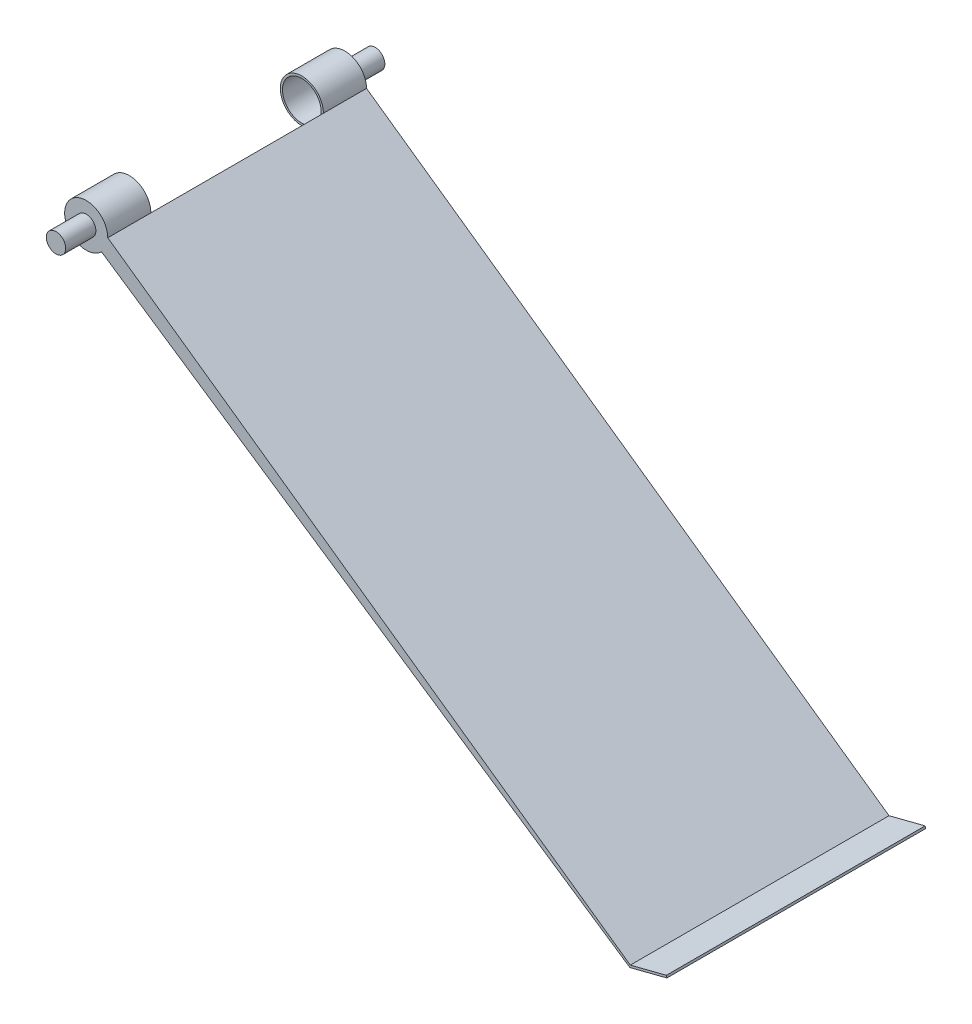
ISO-10303-21;
HEADER;
FILE_DESCRIPTION(('STEP AP214'),'2;1');
FILE_NAME('part.step','',(''),(''),'','','');
FILE_SCHEMA(('AUTOMOTIVE_DESIGN { 1 0 10303 214 1 1 1 1 }'));
ENDSEC;
DATA;
#1=APPLICATION_CONTEXT('core data for automotive mechanical design processes');
#2=APPLICATION_PROTOCOL_DEFINITION('international standard','automotive_design',2000,#1);
#3=PRODUCT_CONTEXT('',#1,'mechanical');
#4=PRODUCT('Part','Part','',(#3));
#5=PRODUCT_RELATED_PRODUCT_CATEGORY('part','',(#4));
#6=PRODUCT_DEFINITION_FORMATION('','',#4);
#7=PRODUCT_DEFINITION_CONTEXT('part definition',#1,'design');
#8=PRODUCT_DEFINITION('design','',#6,#7);
#9=PRODUCT_DEFINITION_SHAPE('','',#8);
#10=(LENGTH_UNIT() NAMED_UNIT(*) SI_UNIT(.MILLI.,.METRE.));
#11=(NAMED_UNIT(*) PLANE_ANGLE_UNIT() SI_UNIT($,.RADIAN.));
#12=(NAMED_UNIT(*) SI_UNIT($,.STERADIAN.) SOLID_ANGLE_UNIT());
#13=UNCERTAINTY_MEASURE_WITH_UNIT(LENGTH_MEASURE(1.E-05),#10,'distance_accuracy_value','');
#14=(GEOMETRIC_REPRESENTATION_CONTEXT(3) GLOBAL_UNCERTAINTY_ASSIGNED_CONTEXT((#13)) GLOBAL_UNIT_ASSIGNED_CONTEXT((#10,
#11,#12)) REPRESENTATION_CONTEXT('',''));
#15=CARTESIAN_POINT('',(0.,0.,0.));
#16=DIRECTION('',(0.,0.,1.));
#17=DIRECTION('',(1.,0.,0.));
#18=AXIS2_PLACEMENT_3D('',#15,#16,#17);
#19=CARTESIAN_POINT('',(0.,0.,-6.));
#20=DIRECTION('',(0.,0.,1.));
#21=DIRECTION('',(1.,0.,0.));
#22=AXIS2_PLACEMENT_3D('',#19,#20,#21);
#23=CYLINDRICAL_SURFACE('',#22,0.5);
#24=DIRECTION('',(0.,0.,1.));
#25=VECTOR('',#24,1.);
#26=CARTESIAN_POINT('',(0.5,0.,-6.));
#27=LINE('',#26,#25);
#28=CARTESIAN_POINT('',(0.5,0.,-5.));
#29=VERTEX_POINT('',#28);
#30=CARTESIAN_POINT('',(0.5,0.,-1.));
#31=VERTEX_POINT('',#30);
#32=EDGE_CURVE('E54',#29,#31,#27,.T.);
#33=ORIENTED_EDGE('',*,*,#32,.F.);
#34=CARTESIAN_POINT('',(0.,0.,-5.));
#35=DIRECTION('',(0.,0.,1.));
#36=DIRECTION('',(1.,0.,0.));
#37=AXIS2_PLACEMENT_3D('',#34,#35,#36);
#38=CIRCLE('',#37,0.5);
#39=CARTESIAN_POINT('',(0.353553390593274,-0.353553390593274,-5.));
#40=VERTEX_POINT('',#39);
#41=EDGE_CURVE('E59',#40,#29,#38,.T.);
#42=ORIENTED_EDGE('',*,*,#41,.F.);
#43=DIRECTION('',(0.,0.,1.));
#44=VECTOR('',#43,1.);
#45=CARTESIAN_POINT('',(0.353553390593274,-0.353553390593274,-6.));
#46=LINE('',#45,#44);
#47=CARTESIAN_POINT('',(0.353553390593274,-0.353553390593274,-1.));
#48=VERTEX_POINT('',#47);
#49=EDGE_CURVE('E120',#40,#48,#46,.T.);
#50=ORIENTED_EDGE('',*,*,#49,.T.);
#51=CARTESIAN_POINT('',(0.,0.,-1.));
#52=DIRECTION('',(0.,0.,1.));
#53=DIRECTION('',(1.,0.,0.));
#54=AXIS2_PLACEMENT_3D('',#51,#52,#53);
#55=CIRCLE('',#54,0.5);
#56=EDGE_CURVE('E162',#31,#48,#55,.F.);
#57=ORIENTED_EDGE('',*,*,#56,.F.);
#58=EDGE_LOOP('',(#33,#42,#50,#57));
#59=FACE_BOUND('',#58,.T.);
#60=ADVANCED_FACE('F37',(#59),#23,.F.);
#61=CARTESIAN_POINT('',(0.,0.,-1.));
#62=DIRECTION('',(0.,0.,1.));
#63=DIRECTION('',(1.,0.,0.));
#64=AXIS2_PLACEMENT_3D('',#61,#62,#63);
#65=CYLINDRICAL_SURFACE('',#64,0.5);
#66=CARTESIAN_POINT('',(0.5,0.,0.));
#67=VERTEX_POINT('',#66);
#68=EDGE_CURVE('E163',#31,#67,#27,.T.);
#69=ORIENTED_EDGE('',*,*,#68,.F.);
#70=CARTESIAN_POINT('',(0.,0.,-1.));
#71=DIRECTION('',(0.,0.,1.));
#72=DIRECTION('',(1.,0.,0.));
#73=AXIS2_PLACEMENT_3D('',#70,#71,#72);
#74=CIRCLE('',#73,0.5);
#75=EDGE_CURVE('E46',#31,#48,#74,.T.);
#76=ORIENTED_EDGE('',*,*,#75,.T.);
#77=CARTESIAN_POINT('',(0.353553390593274,-0.353553390593274,0.));
#78=VERTEX_POINT('',#77);
#79=EDGE_CURVE('E126',#48,#78,#46,.T.);
#80=ORIENTED_EDGE('',*,*,#79,.T.);
#81=CARTESIAN_POINT('',(0.,0.,0.));
#82=DIRECTION('',(0.,0.,1.));
#83=DIRECTION('',(1.,0.,0.));
#84=AXIS2_PLACEMENT_3D('',#81,#82,#83);
#85=CIRCLE('',#84,0.5);
#86=EDGE_CURVE('E41',#67,#78,#85,.T.);
#87=ORIENTED_EDGE('',*,*,#86,.F.);
#88=EDGE_LOOP('',(#69,#76,#80,#87));
#89=FACE_BOUND('',#88,.T.);
#90=ADVANCED_FACE('F39',(#89),#65,.T.);
#91=CARTESIAN_POINT('',(0.,0.,-1.));
#92=DIRECTION('',(0.,0.,1.));
#93=DIRECTION('',(1.,0.,0.));
#94=AXIS2_PLACEMENT_3D('',#91,#92,#93);
#95=PLANE('',#94);
#96=CARTESIAN_POINT('',(0.,0.,-1.));
#97=DIRECTION('',(0.,0.,-1.));
#98=DIRECTION('',(-1.,0.,0.));
#99=AXIS2_PLACEMENT_3D('',#96,#97,#98);
#100=CIRCLE('',#99,0.45);
#101=CARTESIAN_POINT('',(-0.45,0.,-1.));
#102=VERTEX_POINT('',#101);
#103=EDGE_CURVE('E175',#102,#102,#100,.T.);
#104=ORIENTED_EDGE('',*,*,#103,.F.);
#105=EDGE_LOOP('',(#104));
#106=FACE_BOUND('',#105,.T.);
#107=ORIENTED_EDGE('',*,*,#75,.F.);
#108=ORIENTED_EDGE('',*,*,#56,.T.);
#109=EDGE_LOOP('',(#107,#108));
#110=FACE_BOUND('',#109,.T.);
#111=ADVANCED_FACE('F193',(#106,#110),#95,.F.);
#112=CARTESIAN_POINT('',(0.,0.,0.));
#113=DIRECTION('',(0.,0.,1.));
#114=DIRECTION('',(1.,0.,0.));
#115=AXIS2_PLACEMENT_3D('',#112,#113,#114);
#116=PLANE('',#115);
#117=CARTESIAN_POINT('',(0.,0.,0.));
#118=DIRECTION('',(0.,0.,1.));
#119=DIRECTION('',(1.,0.,0.));
#120=AXIS2_PLACEMENT_3D('',#117,#118,#119);
#121=CIRCLE('',#120,0.225);
#122=CARTESIAN_POINT('',(0.225,0.,0.));
#123=VERTEX_POINT('',#122);
#124=EDGE_CURVE('E11',#123,#123,#121,.T.);
#125=ORIENTED_EDGE('',*,*,#124,.F.);
#126=EDGE_LOOP('',(#125));
#127=FACE_BOUND('',#126,.T.);
#128=ORIENTED_EDGE('',*,*,#86,.T.);
#129=DIRECTION('',(0.829578631621127,-0.558389912120212,0.));
#130=VECTOR('',#129,1.);
#131=CARTESIAN_POINT('',(12.6061318892852,-8.60077188242059,0.));
#132=LINE('',#131,#130);
#133=CARTESIAN_POINT('',(12.6061318892852,-8.60077188242059,0.));
#134=VERTEX_POINT('',#133);
#135=EDGE_CURVE('E148',#78,#134,#132,.T.);
#136=ORIENTED_EDGE('',*,*,#135,.T.);
#137=DIRECTION('',(0.968793890194318,0.247867703265594,0.));
#138=VECTOR('',#137,1.);
#139=CARTESIAN_POINT('',(12.6061318892852,-8.60077188242059,0.));
#140=LINE('',#139,#138);
#141=CARTESIAN_POINT('',(13.4647976284602,-8.38108066966998,0.));
#142=VERTEX_POINT('',#141);
#143=EDGE_CURVE('E151',#134,#142,#140,.T.);
#144=ORIENTED_EDGE('',*,*,#143,.T.);
#145=DIRECTION('',(-0.247867703265583,0.96879389019432,0.));
#146=VECTOR('',#145,1.);
#147=CARTESIAN_POINT('',(13.4647976284602,-8.38108066966998,0.));
#148=LINE('',#147,#146);
#149=CARTESIAN_POINT('',(13.4524042432969,-8.33264097516026,0.));
#150=VERTEX_POINT('',#149);
#151=EDGE_CURVE('E154',#142,#150,#148,.T.);
#152=ORIENTED_EDGE('',*,*,#151,.T.);
#153=DIRECTION('',(-0.968793890194317,-0.247867703265595,0.));
#154=VECTOR('',#153,1.);
#155=CARTESIAN_POINT('',(13.4524042432969,-8.33264097516026,0.));
#156=LINE('',#155,#154);
#157=CARTESIAN_POINT('',(12.6154552908897,-8.54677590797049,0.));
#158=VERTEX_POINT('',#157);
#159=EDGE_CURVE('E157',#150,#158,#156,.T.);
#160=ORIENTED_EDGE('',*,*,#159,.T.);
#161=DIRECTION('',(-0.817136563767121,0.576444130991774,0.));
#162=VECTOR('',#161,1.);
#163=CARTESIAN_POINT('',(12.6154552908897,-8.54677590797049,0.));
#164=LINE('',#163,#162);
#165=EDGE_CURVE('E114',#158,#67,#164,.T.);
#166=ORIENTED_EDGE('',*,*,#165,.T.);
#167=EDGE_LOOP('',(#128,#136,#144,#152,#160,#166));
#168=FACE_BOUND('',#167,.T.);
#169=ADVANCED_FACE('F189',(#127,#168),#116,.T.);
#170=CARTESIAN_POINT('',(0.,0.,-0.1));
#171=DIRECTION('',(0.,0.,-1.));
#172=DIRECTION('',(-1.,0.,0.));
#173=AXIS2_PLACEMENT_3D('',#170,#171,#172);
#174=CYLINDRICAL_SURFACE('',#173,0.45);
#175=CARTESIAN_POINT('',(0.,0.,-0.1));
#176=DIRECTION('',(0.,0.,-1.));
#177=DIRECTION('',(-1.,0.,0.));
#178=AXIS2_PLACEMENT_3D('',#175,#176,#177);
#179=CIRCLE('',#178,0.45);
#180=CARTESIAN_POINT('',(-0.45,0.,-0.1));
#181=VERTEX_POINT('',#180);
#182=EDGE_CURVE('E177',#181,#181,#179,.T.);
#183=ORIENTED_EDGE('',*,*,#182,.F.);
#184=EDGE_LOOP('',(#183));
#185=FACE_BOUND('',#184,.T.);
#186=ORIENTED_EDGE('',*,*,#103,.T.);
#187=EDGE_LOOP('',(#186));
#188=FACE_BOUND('',#187,.T.);
#189=ADVANCED_FACE('F201',(#185,#188),#174,.F.);
#190=CARTESIAN_POINT('',(0.,0.,-0.1));
#191=DIRECTION('',(0.,0.,-1.));
#192=DIRECTION('',(-1.,0.,0.));
#193=AXIS2_PLACEMENT_3D('',#190,#191,#192);
#194=PLANE('',#193);
#195=ORIENTED_EDGE('',*,*,#182,.T.);
#196=EDGE_LOOP('',(#195));
#197=FACE_BOUND('',#196,.T.);
#198=ADVANCED_FACE('F220',(#197),#194,.T.);
#199=CARTESIAN_POINT('',(0.,0.,0.7));
#200=DIRECTION('',(0.,0.,-1.));
#201=DIRECTION('',(-1.,0.,0.));
#202=AXIS2_PLACEMENT_3D('',#199,#200,#201);
#203=CYLINDRICAL_SURFACE('',#202,0.225);
#204=CARTESIAN_POINT('',(0.,0.,0.7));
#205=DIRECTION('',(0.,0.,1.));
#206=DIRECTION('',(1.,0.,0.));
#207=AXIS2_PLACEMENT_3D('',#204,#205,#206);
#208=CIRCLE('',#207,0.225);
#209=CARTESIAN_POINT('',(0.225,0.,0.7));
#210=VERTEX_POINT('',#209);
#211=EDGE_CURVE('E173',#210,#210,#208,.T.);
#212=ORIENTED_EDGE('',*,*,#211,.F.);
#213=EDGE_LOOP('',(#212));
#214=FACE_BOUND('',#213,.T.);
#215=ORIENTED_EDGE('',*,*,#124,.T.);
#216=EDGE_LOOP('',(#215));
#217=FACE_BOUND('',#216,.T.);
#218=ADVANCED_FACE('F216',(#214,#217),#203,.T.);
#219=CARTESIAN_POINT('',(0.,0.,0.7));
#220=DIRECTION('',(0.,0.,1.));
#221=DIRECTION('',(1.,0.,0.));
#222=AXIS2_PLACEMENT_3D('',#219,#220,#221);
#223=PLANE('',#222);
#224=ORIENTED_EDGE('',*,*,#211,.T.);
#225=EDGE_LOOP('',(#224));
#226=FACE_BOUND('',#225,.T.);
#227=ADVANCED_FACE('F212',(#226),#223,.T.);
#228=CARTESIAN_POINT('',(12.6154552908897,-8.54677590797049,-6.));
#229=DIRECTION('',(0.576444130991774,0.817136563767121,0.));
#230=DIRECTION('',(-0.817136563767121,0.576444130991774,0.));
#231=AXIS2_PLACEMENT_3D('',#228,#229,#230);
#232=PLANE('',#231);
#233=ORIENTED_EDGE('',*,*,#165,.F.);
#234=DIRECTION('',(0.,0.,1.));
#235=VECTOR('',#234,1.);
#236=CARTESIAN_POINT('',(12.6154552908897,-8.54677590797049,-6.));
#237=LINE('',#236,#235);
#238=CARTESIAN_POINT('',(12.6154552908897,-8.54677590797049,-6.));
#239=VERTEX_POINT('',#238);
#240=EDGE_CURVE('E164',#239,#158,#237,.T.);
#241=ORIENTED_EDGE('',*,*,#240,.F.);
#242=DIRECTION('',(-0.817136563767121,0.576444130991774,0.));
#243=VECTOR('',#242,1.);
#244=CARTESIAN_POINT('',(12.6154552908897,-8.54677590797049,-6.));
#245=LINE('',#244,#243);
#246=CARTESIAN_POINT('',(0.5,0.,-6.));
#247=VERTEX_POINT('',#246);
#248=EDGE_CURVE('E146',#239,#247,#245,.T.);
#249=ORIENTED_EDGE('',*,*,#248,.T.);
#250=EDGE_CURVE('E129',#247,#29,#27,.T.);
#251=ORIENTED_EDGE('',*,*,#250,.T.);
#252=ORIENTED_EDGE('',*,*,#32,.T.);
#253=ORIENTED_EDGE('',*,*,#68,.T.);
#254=EDGE_LOOP('',(#233,#241,#249,#251,#252,#253));
#255=FACE_BOUND('',#254,.T.);
#256=ADVANCED_FACE('F215',(#255),#232,.T.);
#257=CARTESIAN_POINT('',(13.4524042432969,-8.33264097516026,-6.));
#258=DIRECTION('',(-0.247867703265595,0.968793890194317,0.));
#259=DIRECTION('',(-0.968793890194317,-0.247867703265595,0.));
#260=AXIS2_PLACEMENT_3D('',#257,#258,#259);
#261=PLANE('',#260);
#262=ORIENTED_EDGE('',*,*,#159,.F.);
#263=DIRECTION('',(0.,0.,1.));
#264=VECTOR('',#263,1.);
#265=CARTESIAN_POINT('',(13.4524042432969,-8.33264097516026,-6.));
#266=LINE('',#265,#264);
#267=CARTESIAN_POINT('',(13.4524042432969,-8.33264097516026,-6.));
#268=VERTEX_POINT('',#267);
#269=EDGE_CURVE('E166',#268,#150,#266,.T.);
#270=ORIENTED_EDGE('',*,*,#269,.F.);
#271=DIRECTION('',(-0.968793890194317,-0.247867703265595,0.));
#272=VECTOR('',#271,1.);
#273=CARTESIAN_POINT('',(13.4524042432969,-8.33264097516026,-6.));
#274=LINE('',#273,#272);
#275=EDGE_CURVE('E143',#268,#239,#274,.T.);
#276=ORIENTED_EDGE('',*,*,#275,.T.);
#277=ORIENTED_EDGE('',*,*,#240,.T.);
#278=EDGE_LOOP('',(#262,#270,#276,#277));
#279=FACE_BOUND('',#278,.T.);
#280=ADVANCED_FACE('F251',(#279),#261,.T.);
#281=CARTESIAN_POINT('',(13.4647976284602,-8.38108066966998,-6.));
#282=DIRECTION('',(0.96879389019432,0.247867703265583,0.));
#283=DIRECTION('',(-0.247867703265583,0.96879389019432,0.));
#284=AXIS2_PLACEMENT_3D('',#281,#282,#283);
#285=PLANE('',#284);
#286=ORIENTED_EDGE('',*,*,#151,.F.);
#287=DIRECTION('',(0.,0.,1.));
#288=VECTOR('',#287,1.);
#289=CARTESIAN_POINT('',(13.4647976284602,-8.38108066966998,-6.));
#290=LINE('',#289,#288);
#291=CARTESIAN_POINT('',(13.4647976284602,-8.38108066966998,-6.));
#292=VERTEX_POINT('',#291);
#293=EDGE_CURVE('E168',#292,#142,#290,.T.);
#294=ORIENTED_EDGE('',*,*,#293,.F.);
#295=DIRECTION('',(-0.247867703265583,0.96879389019432,0.));
#296=VECTOR('',#295,1.);
#297=CARTESIAN_POINT('',(13.4647976284602,-8.38108066966998,-6.));
#298=LINE('',#297,#296);
#299=EDGE_CURVE('E140',#292,#268,#298,.T.);
#300=ORIENTED_EDGE('',*,*,#299,.T.);
#301=ORIENTED_EDGE('',*,*,#269,.T.);
#302=EDGE_LOOP('',(#286,#294,#300,#301));
#303=FACE_BOUND('',#302,.T.);
#304=ADVANCED_FACE('F260',(#303),#285,.T.);
#305=CARTESIAN_POINT('',(12.6061318892852,-8.60077188242059,-6.));
#306=DIRECTION('',(0.247867703265594,-0.968793890194317,0.));
#307=DIRECTION('',(0.968793890194318,0.247867703265594,0.));
#308=AXIS2_PLACEMENT_3D('',#305,#306,#307);
#309=PLANE('',#308);
#310=ORIENTED_EDGE('',*,*,#143,.F.);
#311=DIRECTION('',(0.,0.,1.));
#312=VECTOR('',#311,1.);
#313=CARTESIAN_POINT('',(12.6061318892852,-8.60077188242059,-6.));
#314=LINE('',#313,#312);
#315=CARTESIAN_POINT('',(12.6061318892852,-8.60077188242059,-6.));
#316=VERTEX_POINT('',#315);
#317=EDGE_CURVE('E124',#316,#134,#314,.T.);
#318=ORIENTED_EDGE('',*,*,#317,.F.);
#319=DIRECTION('',(0.968793890194318,0.247867703265594,0.));
#320=VECTOR('',#319,1.);
#321=CARTESIAN_POINT('',(12.6061318892852,-8.60077188242059,-6.));
#322=LINE('',#321,#320);
#323=EDGE_CURVE('E112',#316,#292,#322,.T.);
#324=ORIENTED_EDGE('',*,*,#323,.T.);
#325=ORIENTED_EDGE('',*,*,#293,.T.);
#326=EDGE_LOOP('',(#310,#318,#324,#325));
#327=FACE_BOUND('',#326,.T.);
#328=ADVANCED_FACE('F268',(#327),#309,.T.);
#329=CARTESIAN_POINT('',(12.6061318892852,-8.60077188242059,-6.));
#330=DIRECTION('',(-0.558389912120212,-0.829578631621127,0.));
#331=DIRECTION('',(0.829578631621127,-0.558389912120212,0.));
#332=AXIS2_PLACEMENT_3D('',#329,#330,#331);
#333=PLANE('',#332);
#334=ORIENTED_EDGE('',*,*,#135,.F.);
#335=ORIENTED_EDGE('',*,*,#79,.F.);
#336=ORIENTED_EDGE('',*,*,#49,.F.);
#337=CARTESIAN_POINT('',(0.353553390593274,-0.353553390593274,-6.));
#338=VERTEX_POINT('',#337);
#339=EDGE_CURVE('E117',#338,#40,#46,.T.);
#340=ORIENTED_EDGE('',*,*,#339,.F.);
#341=DIRECTION('',(0.829578631621127,-0.558389912120212,0.));
#342=VECTOR('',#341,1.);
#343=CARTESIAN_POINT('',(12.6061318892852,-8.60077188242059,-6.));
#344=LINE('',#343,#342);
#345=EDGE_CURVE('E104',#338,#316,#344,.T.);
#346=ORIENTED_EDGE('',*,*,#345,.T.);
#347=ORIENTED_EDGE('',*,*,#317,.T.);
#348=EDGE_LOOP('',(#334,#335,#336,#340,#346,#347));
#349=FACE_BOUND('',#348,.T.);
#350=ADVANCED_FACE('F118',(#349),#333,.T.);
#351=CARTESIAN_POINT('',(0.,0.,-6.));
#352=DIRECTION('',(0.,0.,1.));
#353=DIRECTION('',(1.,0.,0.));
#354=AXIS2_PLACEMENT_3D('',#351,#352,#353);
#355=PLANE('',#354);
#356=CARTESIAN_POINT('',(0.,0.,-6.));
#357=DIRECTION('',(0.,0.,1.));
#358=DIRECTION('',(1.,0.,0.));
#359=AXIS2_PLACEMENT_3D('',#356,#357,#358);
#360=CIRCLE('',#359,0.225);
#361=CARTESIAN_POINT('',(0.225,0.,-6.));
#362=VERTEX_POINT('',#361);
#363=EDGE_CURVE('E433',#362,#362,#360,.T.);
#364=ORIENTED_EDGE('',*,*,#363,.T.);
#365=EDGE_LOOP('',(#364));
#366=FACE_BOUND('',#365,.T.);
#367=ORIENTED_EDGE('',*,*,#345,.F.);
#368=CARTESIAN_POINT('',(0.,0.,-6.));
#369=DIRECTION('',(0.,0.,1.));
#370=DIRECTION('',(1.,0.,0.));
#371=AXIS2_PLACEMENT_3D('',#368,#369,#370);
#372=CIRCLE('',#371,0.5);
#373=EDGE_CURVE('E109',#247,#338,#372,.T.);
#374=ORIENTED_EDGE('',*,*,#373,.F.);
#375=ORIENTED_EDGE('',*,*,#248,.F.);
#376=ORIENTED_EDGE('',*,*,#275,.F.);
#377=ORIENTED_EDGE('',*,*,#299,.F.);
#378=ORIENTED_EDGE('',*,*,#323,.F.);
#379=EDGE_LOOP('',(#367,#374,#375,#376,#377,#378));
#380=FACE_BOUND('',#379,.T.);
#381=ADVANCED_FACE('F106',(#366,#380),#355,.F.);
#382=CARTESIAN_POINT('',(0.,0.,-5.));
#383=DIRECTION('',(0.,0.,-1.));
#384=DIRECTION('',(-1.,0.,0.));
#385=AXIS2_PLACEMENT_3D('',#382,#383,#384);
#386=CYLINDRICAL_SURFACE('',#385,0.5);
#387=ORIENTED_EDGE('',*,*,#250,.F.);
#388=ORIENTED_EDGE('',*,*,#373,.T.);
#389=ORIENTED_EDGE('',*,*,#339,.T.);
#390=EDGE_CURVE('E132',#29,#40,#38,.T.);
#391=ORIENTED_EDGE('',*,*,#390,.F.);
#392=EDGE_LOOP('',(#387,#388,#389,#391));
#393=FACE_BOUND('',#392,.T.);
#394=ADVANCED_FACE('F128',(#393),#386,.T.);
#395=CARTESIAN_POINT('',(0.,0.,-5.));
#396=DIRECTION('',(0.,0.,-1.));
#397=DIRECTION('',(1.,0.,0.));
#398=AXIS2_PLACEMENT_3D('',#395,#396,#397);
#399=PLANE('',#398);
#400=CARTESIAN_POINT('',(0.,0.,-5.));
#401=DIRECTION('',(0.,0.,-1.));
#402=DIRECTION('',(-1.,0.,0.));
#403=AXIS2_PLACEMENT_3D('',#400,#401,#402);
#404=CIRCLE('',#403,0.45);
#405=CARTESIAN_POINT('',(-0.45,0.,-5.));
#406=VERTEX_POINT('',#405);
#407=EDGE_CURVE('E135',#406,#406,#404,.T.);
#408=ORIENTED_EDGE('',*,*,#407,.T.);
#409=EDGE_LOOP('',(#408));
#410=FACE_BOUND('',#409,.T.);
#411=ORIENTED_EDGE('',*,*,#390,.T.);
#412=ORIENTED_EDGE('',*,*,#41,.T.);
#413=EDGE_LOOP('',(#411,#412));
#414=FACE_BOUND('',#413,.T.);
#415=ADVANCED_FACE('F293',(#410,#414),#399,.F.);
#416=CARTESIAN_POINT('',(0.,0.,-5.9));
#417=DIRECTION('',(0.,0.,1.));
#418=DIRECTION('',(1.,0.,0.));
#419=AXIS2_PLACEMENT_3D('',#416,#417,#418);
#420=CYLINDRICAL_SURFACE('',#419,0.45);
#421=CARTESIAN_POINT('',(0.,0.,-5.9));
#422=DIRECTION('',(0.,0.,-1.));
#423=DIRECTION('',(-1.,0.,0.));
#424=AXIS2_PLACEMENT_3D('',#421,#422,#423);
#425=CIRCLE('',#424,0.45);
#426=CARTESIAN_POINT('',(-0.45,0.,-5.9));
#427=VERTEX_POINT('',#426);
#428=EDGE_CURVE('E130',#427,#427,#425,.T.);
#429=ORIENTED_EDGE('',*,*,#428,.T.);
#430=EDGE_LOOP('',(#429));
#431=FACE_BOUND('',#430,.T.);
#432=ORIENTED_EDGE('',*,*,#407,.F.);
#433=EDGE_LOOP('',(#432));
#434=FACE_BOUND('',#433,.T.);
#435=ADVANCED_FACE('F300',(#431,#434),#420,.F.);
#436=CARTESIAN_POINT('',(0.,0.,-5.9));
#437=DIRECTION('',(0.,0.,1.));
#438=DIRECTION('',(-1.,0.,0.));
#439=AXIS2_PLACEMENT_3D('',#436,#437,#438);
#440=PLANE('',#439);
#441=ORIENTED_EDGE('',*,*,#428,.F.);
#442=EDGE_LOOP('',(#441));
#443=FACE_BOUND('',#442,.T.);
#444=ADVANCED_FACE('F308',(#443),#440,.T.);
#445=CARTESIAN_POINT('',(0.,0.,-6.7));
#446=DIRECTION('',(0.,0.,1.));
#447=DIRECTION('',(1.,0.,0.));
#448=AXIS2_PLACEMENT_3D('',#445,#446,#447);
#449=CYLINDRICAL_SURFACE('',#448,0.225);
#450=CARTESIAN_POINT('',(0.,0.,-6.7));
#451=DIRECTION('',(0.,0.,1.));
#452=DIRECTION('',(1.,0.,0.));
#453=AXIS2_PLACEMENT_3D('',#450,#451,#452);
#454=CIRCLE('',#453,0.225);
#455=CARTESIAN_POINT('',(0.225,0.,-6.7));
#456=VERTEX_POINT('',#455);
#457=EDGE_CURVE('E432',#456,#456,#454,.T.);
#458=ORIENTED_EDGE('',*,*,#457,.T.);
#459=EDGE_LOOP('',(#458));
#460=FACE_BOUND('',#459,.T.);
#461=ORIENTED_EDGE('',*,*,#363,.F.);
#462=EDGE_LOOP('',(#461));
#463=FACE_BOUND('',#462,.T.);
#464=ADVANCED_FACE('F316',(#460,#463),#449,.T.);
#465=CARTESIAN_POINT('',(0.,0.,-6.7));
#466=DIRECTION('',(0.,0.,-1.));
#467=DIRECTION('',(1.,0.,0.));
#468=AXIS2_PLACEMENT_3D('',#465,#466,#467);
#469=PLANE('',#468);
#470=ORIENTED_EDGE('',*,*,#457,.F.);
#471=EDGE_LOOP('',(#470));
#472=FACE_BOUND('',#471,.T.);
#473=ADVANCED_FACE('F324',(#472),#469,.T.);
#474=CLOSED_SHELL('',(#60,#90,#111,#169,#189,#198,#218,#227,#256,#280,#304,#328,#350,#381,#394,
#415,#435,#444,#464,#473));
#475=MANIFOLD_SOLID_BREP('B2',#474);
#476=ADVANCED_BREP_SHAPE_REPRESENTATION('',(#18,#475),#14);
#477=SHAPE_DEFINITION_REPRESENTATION(#9,#476);
ENDSEC;
END-ISO-10303-21;
